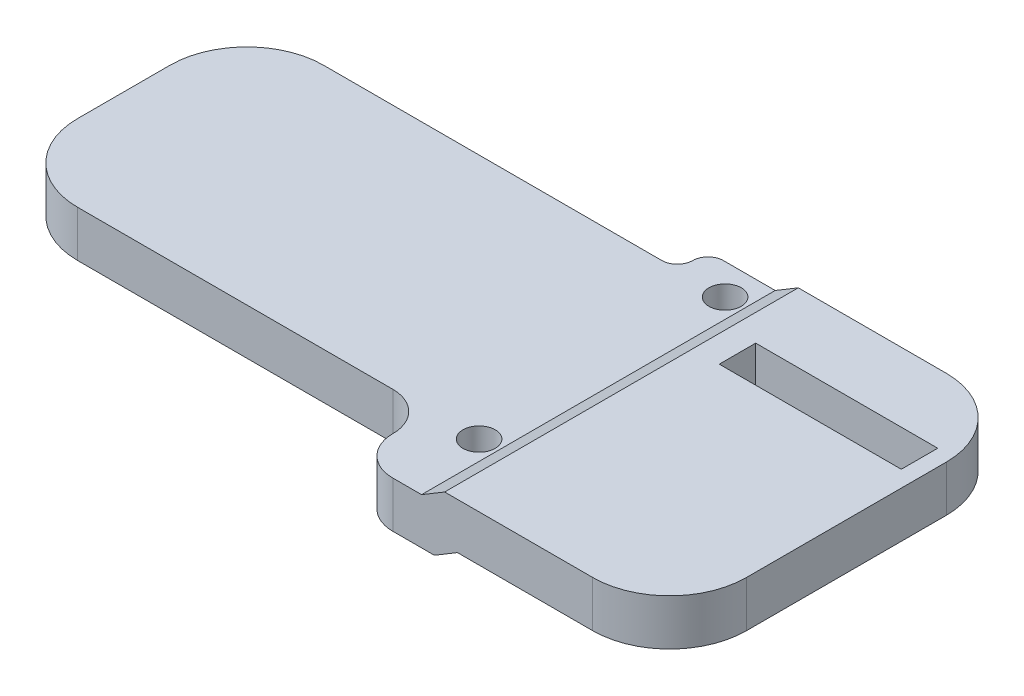
ISO-10303-21;
HEADER;
FILE_DESCRIPTION(('STEP AP214'),'2;1');
FILE_NAME('part.step','',(''),(''),'','','');
FILE_SCHEMA(('AUTOMOTIVE_DESIGN { 1 0 10303 214 1 1 1 1 }'));
ENDSEC;
DATA;
#1=APPLICATION_CONTEXT('core data for automotive mechanical design processes');
#2=APPLICATION_PROTOCOL_DEFINITION('international standard','automotive_design',2000,#1);
#3=PRODUCT_CONTEXT('',#1,'mechanical');
#4=PRODUCT('Part','Part','',(#3));
#5=PRODUCT_RELATED_PRODUCT_CATEGORY('part','',(#4));
#6=PRODUCT_DEFINITION_FORMATION('','',#4);
#7=PRODUCT_DEFINITION_CONTEXT('part definition',#1,'design');
#8=PRODUCT_DEFINITION('design','',#6,#7);
#9=PRODUCT_DEFINITION_SHAPE('','',#8);
#10=(LENGTH_UNIT() NAMED_UNIT(*) SI_UNIT(.MILLI.,.METRE.));
#11=(NAMED_UNIT(*) PLANE_ANGLE_UNIT() SI_UNIT($,.RADIAN.));
#12=(NAMED_UNIT(*) SI_UNIT($,.STERADIAN.) SOLID_ANGLE_UNIT());
#13=UNCERTAINTY_MEASURE_WITH_UNIT(LENGTH_MEASURE(1.E-05),#10,'distance_accuracy_value','');
#14=(GEOMETRIC_REPRESENTATION_CONTEXT(3) GLOBAL_UNCERTAINTY_ASSIGNED_CONTEXT((#13)) GLOBAL_UNIT_ASSIGNED_CONTEXT((#10,
#11,#12)) REPRESENTATION_CONTEXT('',''));
#15=CARTESIAN_POINT('',(0.,0.,0.));
#16=DIRECTION('',(0.,0.,1.));
#17=DIRECTION('',(1.,0.,0.));
#18=AXIS2_PLACEMENT_3D('',#15,#16,#17);
#19=CARTESIAN_POINT('',(0.,3.,-16.));
#20=DIRECTION('',(0.,0.,-1.));
#21=DIRECTION('',(-1.,0.,0.));
#22=AXIS2_PLACEMENT_3D('',#19,#20,#21);
#23=PLANE('',#22);
#24=DIRECTION('',(1.,0.,0.));
#25=VECTOR('',#24,1.);
#26=CARTESIAN_POINT('',(0.,0.,-16.));
#27=LINE('',#26,#25);
#28=CARTESIAN_POINT('',(5.,0.,-16.));
#29=VERTEX_POINT('',#28);
#30=CARTESIAN_POINT('',(27.,0.,-16.));
#31=VERTEX_POINT('',#30);
#32=EDGE_CURVE('E319',#29,#31,#27,.T.);
#33=ORIENTED_EDGE('',*,*,#32,.F.);
#34=DIRECTION('',(0.,-1.,0.));
#35=VECTOR('',#34,1.);
#36=CARTESIAN_POINT('',(5.,3.,-16.));
#37=LINE('',#36,#35);
#38=CARTESIAN_POINT('',(5.,3.,-16.));
#39=VERTEX_POINT('',#38);
#40=EDGE_CURVE('E439',#29,#39,#37,.F.);
#41=ORIENTED_EDGE('',*,*,#40,.T.);
#42=DIRECTION('',(1.,0.,0.));
#43=VECTOR('',#42,1.);
#44=CARTESIAN_POINT('',(0.,3.,-16.));
#45=LINE('',#44,#43);
#46=CARTESIAN_POINT('',(27.,3.,-16.));
#47=VERTEX_POINT('',#46);
#48=EDGE_CURVE('E337',#39,#47,#45,.T.);
#49=ORIENTED_EDGE('',*,*,#48,.T.);
#50=DIRECTION('',(0.,-1.,0.));
#51=VECTOR('',#50,1.);
#52=CARTESIAN_POINT('',(27.,3.,-16.));
#53=LINE('',#52,#51);
#54=EDGE_CURVE('E369',#47,#31,#53,.T.);
#55=ORIENTED_EDGE('',*,*,#54,.T.);
#56=EDGE_LOOP('',(#33,#41,#49,#55));
#57=FACE_BOUND('',#56,.T.);
#58=ADVANCED_FACE('F37',(#57),#23,.T.);
#59=CARTESIAN_POINT('',(0.,3.,0.));
#60=DIRECTION('',(1.,0.,0.));
#61=DIRECTION('',(0.,0.,-1.));
#62=AXIS2_PLACEMENT_3D('',#59,#60,#61);
#63=PLANE('',#62);
#64=DIRECTION('',(0.,0.,1.));
#65=VECTOR('',#64,1.);
#66=CARTESIAN_POINT('',(0.,0.,0.));
#67=LINE('',#66,#65);
#68=CARTESIAN_POINT('',(0.,0.,-11.));
#69=VERTEX_POINT('',#68);
#70=CARTESIAN_POINT('',(0.,0.,-5.));
#71=VERTEX_POINT('',#70);
#72=EDGE_CURVE('E338',#69,#71,#67,.T.);
#73=ORIENTED_EDGE('',*,*,#72,.T.);
#74=DIRECTION('',(0.,-1.,0.));
#75=VECTOR('',#74,1.);
#76=CARTESIAN_POINT('',(0.,3.,-5.));
#77=LINE('',#76,#75);
#78=CARTESIAN_POINT('',(0.,3.,-5.));
#79=VERTEX_POINT('',#78);
#80=EDGE_CURVE('E495',#71,#79,#77,.F.);
#81=ORIENTED_EDGE('',*,*,#80,.T.);
#82=DIRECTION('',(0.,0.,1.));
#83=VECTOR('',#82,1.);
#84=CARTESIAN_POINT('',(0.,3.,0.));
#85=LINE('',#84,#83);
#86=CARTESIAN_POINT('',(0.,3.,-11.));
#87=VERTEX_POINT('',#86);
#88=EDGE_CURVE('E333',#87,#79,#85,.T.);
#89=ORIENTED_EDGE('',*,*,#88,.F.);
#90=DIRECTION('',(0.,-1.,0.));
#91=VECTOR('',#90,1.);
#92=CARTESIAN_POINT('',(0.,0.,-11.));
#93=LINE('',#92,#91);
#94=EDGE_CURVE('E501',#87,#69,#93,.T.);
#95=ORIENTED_EDGE('',*,*,#94,.T.);
#96=EDGE_LOOP('',(#73,#81,#89,#95));
#97=FACE_BOUND('',#96,.T.);
#98=ADVANCED_FACE('F465',(#97),#63,.F.);
#99=CARTESIAN_POINT('',(0.,3.,0.));
#100=DIRECTION('',(0.,0.,-1.));
#101=DIRECTION('',(-1.,0.,0.));
#102=AXIS2_PLACEMENT_3D('',#99,#100,#101);
#103=PLANE('',#102);
#104=DIRECTION('',(1.,0.,0.));
#105=VECTOR('',#104,1.);
#106=CARTESIAN_POINT('',(0.,0.,0.));
#107=LINE('',#106,#105);
#108=CARTESIAN_POINT('',(5.,0.,0.));
#109=VERTEX_POINT('',#108);
#110=CARTESIAN_POINT('',(25.5,0.,0.));
#111=VERTEX_POINT('',#110);
#112=EDGE_CURVE('E341',#109,#111,#107,.T.);
#113=ORIENTED_EDGE('',*,*,#112,.T.);
#114=DIRECTION('',(0.,-1.,0.));
#115=VECTOR('',#114,1.);
#116=CARTESIAN_POINT('',(25.5,3.,0.));
#117=LINE('',#116,#115);
#118=CARTESIAN_POINT('',(25.5,3.,0.));
#119=VERTEX_POINT('',#118);
#120=EDGE_CURVE('E59',#111,#119,#117,.F.);
#121=ORIENTED_EDGE('',*,*,#120,.T.);
#122=DIRECTION('',(1.,0.,0.));
#123=VECTOR('',#122,1.);
#124=CARTESIAN_POINT('',(0.,3.,0.));
#125=LINE('',#124,#123);
#126=CARTESIAN_POINT('',(5.,3.,0.));
#127=VERTEX_POINT('',#126);
#128=EDGE_CURVE('E336',#127,#119,#125,.T.);
#129=ORIENTED_EDGE('',*,*,#128,.F.);
#130=DIRECTION('',(0.,-1.,0.));
#131=VECTOR('',#130,1.);
#132=CARTESIAN_POINT('',(5.,3.,0.));
#133=LINE('',#132,#131);
#134=EDGE_CURVE('E353',#127,#109,#133,.T.);
#135=ORIENTED_EDGE('',*,*,#134,.T.);
#136=EDGE_LOOP('',(#113,#121,#129,#135));
#137=FACE_BOUND('',#136,.T.);
#138=ADVANCED_FACE('F453',(#137),#103,.F.);
#139=CARTESIAN_POINT('',(0.,3.,0.));
#140=DIRECTION('',(0.,1.,0.));
#141=DIRECTION('',(0.,0.,1.));
#142=AXIS2_PLACEMENT_3D('',#139,#140,#141);
#143=PLANE('',#142);
#144=CARTESIAN_POINT('',(31.11,3.,-16.));
#145=DIRECTION('',(0.,1.,0.));
#146=DIRECTION('',(0.,0.,1.));
#147=AXIS2_PLACEMENT_3D('',#144,#145,#146);
#148=CIRCLE('',#147,1.05);
#149=CARTESIAN_POINT('',(31.11,3.,-14.95));
#150=VERTEX_POINT('',#149);
#151=EDGE_CURVE('E772',#150,#150,#148,.T.);
#152=ORIENTED_EDGE('',*,*,#151,.F.);
#153=EDGE_LOOP('',(#152));
#154=FACE_BOUND('',#153,.T.);
#155=CARTESIAN_POINT('',(31.11,3.,0.));
#156=DIRECTION('',(0.,1.,0.));
#157=DIRECTION('',(0.,0.,1.));
#158=AXIS2_PLACEMENT_3D('',#155,#156,#157);
#159=CIRCLE('',#158,1.05);
#160=CARTESIAN_POINT('',(31.11,3.,1.05));
#161=VERTEX_POINT('',#160);
#162=EDGE_CURVE('E241',#161,#161,#159,.T.);
#163=ORIENTED_EDGE('',*,*,#162,.F.);
#164=EDGE_LOOP('',(#163));
#165=FACE_BOUND('',#164,.T.);
#166=ORIENTED_EDGE('',*,*,#128,.T.);
#167=CARTESIAN_POINT('',(25.5,3.,2.5));
#168=DIRECTION('',(0.,1.,0.));
#169=DIRECTION('',(0.,0.,1.));
#170=AXIS2_PLACEMENT_3D('',#167,#168,#169);
#171=CIRCLE('',#170,2.5);
#172=CARTESIAN_POINT('',(28.,3.,2.5));
#173=VERTEX_POINT('',#172);
#174=EDGE_CURVE('E11',#119,#173,#171,.F.);
#175=ORIENTED_EDGE('',*,*,#174,.T.);
#176=CARTESIAN_POINT('',(30.5,3.,2.5));
#177=DIRECTION('',(0.,1.,0.));
#178=DIRECTION('',(0.,0.,1.));
#179=AXIS2_PLACEMENT_3D('',#176,#177,#178);
#180=CIRCLE('',#179,2.5);
#181=CARTESIAN_POINT('',(30.5,3.,5.));
#182=VERTEX_POINT('',#181);
#183=EDGE_CURVE('E437',#173,#182,#180,.T.);
#184=ORIENTED_EDGE('',*,*,#183,.T.);
#185=DIRECTION('',(1.,0.,0.));
#186=VECTOR('',#185,1.);
#187=CARTESIAN_POINT('',(28.,3.,5.));
#188=LINE('',#187,#186);
#189=CARTESIAN_POINT('',(32.3690481051547,3.,5.));
#190=VERTEX_POINT('',#189);
#191=EDGE_CURVE('E307',#182,#190,#188,.T.);
#192=ORIENTED_EDGE('',*,*,#191,.T.);
#193=DIRECTION('',(0.,0.,-1.));
#194=VECTOR('',#193,1.);
#195=CARTESIAN_POINT('',(32.3690481051547,3.,5.));
#196=LINE('',#195,#194);
#197=CARTESIAN_POINT('',(32.3690481051547,3.,-18.));
#198=VERTEX_POINT('',#197);
#199=EDGE_CURVE('E325',#190,#198,#196,.T.);
#200=ORIENTED_EDGE('',*,*,#199,.T.);
#201=DIRECTION('',(1.,0.,0.));
#202=VECTOR('',#201,1.);
#203=CARTESIAN_POINT('',(28.,3.,-18.));
#204=LINE('',#203,#202);
#205=CARTESIAN_POINT('',(29.,3.,-18.));
#206=VERTEX_POINT('',#205);
#207=EDGE_CURVE('E292',#206,#198,#204,.T.);
#208=ORIENTED_EDGE('',*,*,#207,.F.);
#209=CARTESIAN_POINT('',(29.,3.,-17.));
#210=DIRECTION('',(0.,1.,0.));
#211=DIRECTION('',(0.,0.,1.));
#212=AXIS2_PLACEMENT_3D('',#209,#210,#211);
#213=CIRCLE('',#212,1.);
#214=CARTESIAN_POINT('',(28.,3.,-17.));
#215=VERTEX_POINT('',#214);
#216=EDGE_CURVE('E367',#206,#215,#213,.T.);
#217=ORIENTED_EDGE('',*,*,#216,.T.);
#218=CARTESIAN_POINT('',(27.,3.,-17.));
#219=DIRECTION('',(0.,1.,0.));
#220=DIRECTION('',(0.,0.,1.));
#221=AXIS2_PLACEMENT_3D('',#218,#219,#220);
#222=CIRCLE('',#221,1.);
#223=EDGE_CURVE('E374',#215,#47,#222,.F.);
#224=ORIENTED_EDGE('',*,*,#223,.T.);
#225=ORIENTED_EDGE('',*,*,#48,.F.);
#226=CARTESIAN_POINT('',(5.,3.,-11.));
#227=DIRECTION('',(0.,1.,0.));
#228=DIRECTION('',(0.,0.,1.));
#229=AXIS2_PLACEMENT_3D('',#226,#227,#228);
#230=CIRCLE('',#229,5.);
#231=EDGE_CURVE('E496',#39,#87,#230,.T.);
#232=ORIENTED_EDGE('',*,*,#231,.T.);
#233=ORIENTED_EDGE('',*,*,#88,.T.);
#234=CARTESIAN_POINT('',(5.,3.,-5.));
#235=DIRECTION('',(0.,1.,0.));
#236=DIRECTION('',(0.,0.,1.));
#237=AXIS2_PLACEMENT_3D('',#234,#235,#236);
#238=CIRCLE('',#237,5.);
#239=EDGE_CURVE('E442',#79,#127,#238,.T.);
#240=ORIENTED_EDGE('',*,*,#239,.T.);
#241=EDGE_LOOP('',(#166,#175,#184,#192,#200,#208,#217,#224,#225,#232,#233,#240));
#242=FACE_BOUND('',#241,.T.);
#243=ADVANCED_FACE('F512',(#154,#165,#242),#143,.T.);
#244=CARTESIAN_POINT('',(0.,0.,0.));
#245=DIRECTION('',(0.,1.,0.));
#246=DIRECTION('',(0.,0.,1.));
#247=AXIS2_PLACEMENT_3D('',#244,#245,#246);
#248=PLANE('',#247);
#249=CARTESIAN_POINT('',(31.11,0.,-16.));
#250=DIRECTION('',(0.,-1.,0.));
#251=DIRECTION('',(0.,0.,-1.));
#252=AXIS2_PLACEMENT_3D('',#249,#250,#251);
#253=CIRCLE('',#252,1.05);
#254=CARTESIAN_POINT('',(31.11,0.,-17.05));
#255=VERTEX_POINT('',#254);
#256=EDGE_CURVE('E381',#255,#255,#253,.T.);
#257=ORIENTED_EDGE('',*,*,#256,.F.);
#258=EDGE_LOOP('',(#257));
#259=FACE_BOUND('',#258,.T.);
#260=CARTESIAN_POINT('',(31.11,0.,0.));
#261=DIRECTION('',(0.,-1.,0.));
#262=DIRECTION('',(0.,0.,-1.));
#263=AXIS2_PLACEMENT_3D('',#260,#261,#262);
#264=CIRCLE('',#263,1.05);
#265=CARTESIAN_POINT('',(31.11,0.,-1.05));
#266=VERTEX_POINT('',#265);
#267=EDGE_CURVE('E776',#266,#266,#264,.T.);
#268=ORIENTED_EDGE('',*,*,#267,.F.);
#269=EDGE_LOOP('',(#268));
#270=FACE_BOUND('',#269,.T.);
#271=DIRECTION('',(1.,0.,0.));
#272=VECTOR('',#271,1.);
#273=CARTESIAN_POINT('',(4.5,0.,-13.92));
#274=LINE('',#273,#272);
#275=CARTESIAN_POINT('',(4.5,0.,-13.92));
#276=VERTEX_POINT('',#275);
#277=CARTESIAN_POINT('',(27.1,0.,-13.92));
#278=VERTEX_POINT('',#277);
#279=EDGE_CURVE('E247',#276,#278,#274,.T.);
#280=ORIENTED_EDGE('',*,*,#279,.F.);
#281=DIRECTION('',(0.,0.,-1.));
#282=VECTOR('',#281,1.);
#283=CARTESIAN_POINT('',(4.5,0.,-2.08));
#284=LINE('',#283,#282);
#285=CARTESIAN_POINT('',(4.5,0.,-2.08));
#286=VERTEX_POINT('',#285);
#287=EDGE_CURVE('E218',#286,#276,#284,.T.);
#288=ORIENTED_EDGE('',*,*,#287,.F.);
#289=DIRECTION('',(-1.,0.,0.));
#290=VECTOR('',#289,1.);
#291=CARTESIAN_POINT('',(4.5,0.,-2.08));
#292=LINE('',#291,#290);
#293=CARTESIAN_POINT('',(27.1,0.,-2.08));
#294=VERTEX_POINT('',#293);
#295=EDGE_CURVE('E235',#294,#286,#292,.T.);
#296=ORIENTED_EDGE('',*,*,#295,.F.);
#297=DIRECTION('',(0.,0.,1.));
#298=VECTOR('',#297,1.);
#299=CARTESIAN_POINT('',(27.1,0.,-2.08));
#300=LINE('',#299,#298);
#301=EDGE_CURVE('E238',#278,#294,#300,.T.);
#302=ORIENTED_EDGE('',*,*,#301,.F.);
#303=EDGE_LOOP('',(#280,#288,#296,#302));
#304=FACE_BOUND('',#303,.T.);
#305=DIRECTION('',(1.,0.,0.));
#306=VECTOR('',#305,1.);
#307=CARTESIAN_POINT('',(28.,0.,5.));
#308=LINE('',#307,#306);
#309=CARTESIAN_POINT('',(30.5,0.,5.));
#310=VERTEX_POINT('',#309);
#311=CARTESIAN_POINT('',(33.2,0.,5.));
#312=VERTEX_POINT('',#311);
#313=EDGE_CURVE('E305',#310,#312,#308,.T.);
#314=ORIENTED_EDGE('',*,*,#313,.F.);
#315=CARTESIAN_POINT('',(30.5,0.,2.5));
#316=DIRECTION('',(0.,1.,0.));
#317=DIRECTION('',(0.,0.,1.));
#318=AXIS2_PLACEMENT_3D('',#315,#316,#317);
#319=CIRCLE('',#318,2.5);
#320=CARTESIAN_POINT('',(28.,0.,2.5));
#321=VERTEX_POINT('',#320);
#322=EDGE_CURVE('E438',#310,#321,#319,.F.);
#323=ORIENTED_EDGE('',*,*,#322,.T.);
#324=CARTESIAN_POINT('',(25.5,0.,2.5));
#325=DIRECTION('',(0.,1.,0.));
#326=DIRECTION('',(0.,0.,1.));
#327=AXIS2_PLACEMENT_3D('',#324,#325,#326);
#328=CIRCLE('',#327,2.5);
#329=EDGE_CURVE('E46',#321,#111,#328,.T.);
#330=ORIENTED_EDGE('',*,*,#329,.T.);
#331=ORIENTED_EDGE('',*,*,#112,.F.);
#332=CARTESIAN_POINT('',(5.,0.,-5.));
#333=DIRECTION('',(0.,1.,0.));
#334=DIRECTION('',(0.,0.,1.));
#335=AXIS2_PLACEMENT_3D('',#332,#333,#334);
#336=CIRCLE('',#335,5.);
#337=EDGE_CURVE('E503',#109,#71,#336,.F.);
#338=ORIENTED_EDGE('',*,*,#337,.T.);
#339=ORIENTED_EDGE('',*,*,#72,.F.);
#340=CARTESIAN_POINT('',(5.,0.,-11.));
#341=DIRECTION('',(0.,1.,0.));
#342=DIRECTION('',(0.,0.,1.));
#343=AXIS2_PLACEMENT_3D('',#340,#341,#342);
#344=CIRCLE('',#343,5.);
#345=EDGE_CURVE('E356',#69,#29,#344,.F.);
#346=ORIENTED_EDGE('',*,*,#345,.T.);
#347=ORIENTED_EDGE('',*,*,#32,.T.);
#348=CARTESIAN_POINT('',(27.,0.,-17.));
#349=DIRECTION('',(0.,1.,0.));
#350=DIRECTION('',(0.,0.,1.));
#351=AXIS2_PLACEMENT_3D('',#348,#349,#350);
#352=CIRCLE('',#351,1.);
#353=CARTESIAN_POINT('',(28.,0.,-17.));
#354=VERTEX_POINT('',#353);
#355=EDGE_CURVE('E372',#31,#354,#352,.T.);
#356=ORIENTED_EDGE('',*,*,#355,.T.);
#357=CARTESIAN_POINT('',(29.,0.,-17.));
#358=DIRECTION('',(0.,1.,0.));
#359=DIRECTION('',(0.,0.,1.));
#360=AXIS2_PLACEMENT_3D('',#357,#358,#359);
#361=CIRCLE('',#360,1.);
#362=CARTESIAN_POINT('',(29.,0.,-18.));
#363=VERTEX_POINT('',#362);
#364=EDGE_CURVE('E352',#354,#363,#361,.F.);
#365=ORIENTED_EDGE('',*,*,#364,.T.);
#366=DIRECTION('',(1.,0.,0.));
#367=VECTOR('',#366,1.);
#368=CARTESIAN_POINT('',(28.,0.,-18.));
#369=LINE('',#368,#367);
#370=CARTESIAN_POINT('',(33.2,0.,-18.));
#371=VERTEX_POINT('',#370);
#372=EDGE_CURVE('E290',#363,#371,#369,.T.);
#373=ORIENTED_EDGE('',*,*,#372,.T.);
#374=DIRECTION('',(0.,0.,-1.));
#375=VECTOR('',#374,1.);
#376=CARTESIAN_POINT('',(33.2,0.,5.));
#377=LINE('',#376,#375);
#378=EDGE_CURVE('E328',#312,#371,#377,.T.);
#379=ORIENTED_EDGE('',*,*,#378,.F.);
#380=EDGE_LOOP('',(#314,#323,#330,#331,#338,#339,#346,#347,#356,#365,#373,#379));
#381=FACE_BOUND('',#380,.T.);
#382=ADVANCED_FACE('F451',(#259,#270,#304,#381),#248,.F.);
#383=CARTESIAN_POINT('',(48.5,0.9,5.));
#384=DIRECTION('',(0.,-1.,0.));
#385=DIRECTION('',(1.,0.,0.));
#386=AXIS2_PLACEMENT_3D('',#383,#384,#385);
#387=PLANE('',#386);
#388=DIRECTION('',(0.,0.,-1.));
#389=VECTOR('',#388,1.);
#390=CARTESIAN_POINT('',(35.6,0.899999999999998,5.));
#391=LINE('',#390,#389);
#392=CARTESIAN_POINT('',(35.6,0.899999999999999,-11.13));
#393=VERTEX_POINT('',#392);
#394=CARTESIAN_POINT('',(35.6,0.899999999999999,-13.5));
#395=VERTEX_POINT('',#394);
#396=EDGE_CURVE('E283',#393,#395,#391,.T.);
#397=ORIENTED_EDGE('',*,*,#396,.F.);
#398=DIRECTION('',(-1.,0.,0.));
#399=VECTOR('',#398,1.);
#400=CARTESIAN_POINT('',(48.5,0.9,-11.13));
#401=LINE('',#400,#399);
#402=CARTESIAN_POINT('',(47.44,0.9,-11.13));
#403=VERTEX_POINT('',#402);
#404=EDGE_CURVE('E270',#403,#393,#401,.T.);
#405=ORIENTED_EDGE('',*,*,#404,.F.);
#406=DIRECTION('',(0.,0.,1.));
#407=VECTOR('',#406,1.);
#408=CARTESIAN_POINT('',(47.44,0.9,5.));
#409=LINE('',#408,#407);
#410=CARTESIAN_POINT('',(47.44,0.9,-13.5));
#411=VERTEX_POINT('',#410);
#412=EDGE_CURVE('E278',#411,#403,#409,.T.);
#413=ORIENTED_EDGE('',*,*,#412,.F.);
#414=DIRECTION('',(1.,0.,0.));
#415=VECTOR('',#414,1.);
#416=CARTESIAN_POINT('',(48.5,0.9,-13.5));
#417=LINE('',#416,#415);
#418=EDGE_CURVE('E281',#395,#411,#417,.T.);
#419=ORIENTED_EDGE('',*,*,#418,.F.);
#420=EDGE_LOOP('',(#397,#405,#413,#419));
#421=FACE_BOUND('',#420,.T.);
#422=DIRECTION('',(-1.,0.,0.));
#423=VECTOR('',#422,1.);
#424=CARTESIAN_POINT('',(48.5,0.9,-18.));
#425=LINE('',#424,#423);
#426=CARTESIAN_POINT('',(43.5,0.899999999999999,-18.));
#427=VERTEX_POINT('',#426);
#428=CARTESIAN_POINT('',(34.7,0.899999999999998,-18.));
#429=VERTEX_POINT('',#428);
#430=EDGE_CURVE('E285',#427,#429,#425,.T.);
#431=ORIENTED_EDGE('',*,*,#430,.F.);
#432=CARTESIAN_POINT('',(43.5,0.899999999999999,-13.));
#433=DIRECTION('',(0.,-1.,0.));
#434=DIRECTION('',(1.,0.,0.));
#435=AXIS2_PLACEMENT_3D('',#432,#433,#434);
#436=CIRCLE('',#435,5.);
#437=CARTESIAN_POINT('',(48.5,0.9,-13.));
#438=VERTEX_POINT('',#437);
#439=EDGE_CURVE('E386',#427,#438,#436,.T.);
#440=ORIENTED_EDGE('',*,*,#439,.T.);
#441=DIRECTION('',(0.,0.,-1.));
#442=VECTOR('',#441,1.);
#443=CARTESIAN_POINT('',(48.5,0.9,5.));
#444=LINE('',#443,#442);
#445=CARTESIAN_POINT('',(48.5,0.9,0.));
#446=VERTEX_POINT('',#445);
#447=EDGE_CURVE('E316',#446,#438,#444,.T.);
#448=ORIENTED_EDGE('',*,*,#447,.F.);
#449=CARTESIAN_POINT('',(43.5,0.899999999999999,0.));
#450=DIRECTION('',(0.,-1.,0.));
#451=DIRECTION('',(1.,0.,0.));
#452=AXIS2_PLACEMENT_3D('',#449,#450,#451);
#453=CIRCLE('',#452,5.);
#454=CARTESIAN_POINT('',(43.5,0.899999999999999,5.));
#455=VERTEX_POINT('',#454);
#456=EDGE_CURVE('E384',#446,#455,#453,.T.);
#457=ORIENTED_EDGE('',*,*,#456,.T.);
#458=DIRECTION('',(-1.,0.,0.));
#459=VECTOR('',#458,1.);
#460=CARTESIAN_POINT('',(48.5,0.9,5.));
#461=LINE('',#460,#459);
#462=CARTESIAN_POINT('',(34.7,0.899999999999998,5.));
#463=VERTEX_POINT('',#462);
#464=EDGE_CURVE('E300',#455,#463,#461,.T.);
#465=ORIENTED_EDGE('',*,*,#464,.T.);
#466=DIRECTION('',(0.,0.,-1.));
#467=VECTOR('',#466,1.);
#468=CARTESIAN_POINT('',(34.7,0.899999999999998,5.));
#469=LINE('',#468,#467);
#470=EDGE_CURVE('E315',#463,#429,#469,.T.);
#471=ORIENTED_EDGE('',*,*,#470,.T.);
#472=EDGE_LOOP('',(#431,#440,#448,#457,#465,#471));
#473=FACE_BOUND('',#472,.T.);
#474=ADVANCED_FACE('F418',(#421,#473),#387,.T.);
#475=CARTESIAN_POINT('',(48.5,3.9,5.));
#476=DIRECTION('',(1.,0.,0.));
#477=DIRECTION('',(0.,0.,-1.));
#478=AXIS2_PLACEMENT_3D('',#475,#476,#477);
#479=PLANE('',#478);
#480=ORIENTED_EDGE('',*,*,#447,.T.);
#481=DIRECTION('',(0.,-1.,0.));
#482=VECTOR('',#481,1.);
#483=CARTESIAN_POINT('',(48.5,3.9,-13.));
#484=LINE('',#483,#482);
#485=CARTESIAN_POINT('',(48.5,3.9,-13.));
#486=VERTEX_POINT('',#485);
#487=EDGE_CURVE('E391',#438,#486,#484,.F.);
#488=ORIENTED_EDGE('',*,*,#487,.T.);
#489=DIRECTION('',(0.,0.,-1.));
#490=VECTOR('',#489,1.);
#491=CARTESIAN_POINT('',(48.5,3.9,5.));
#492=LINE('',#491,#490);
#493=CARTESIAN_POINT('',(48.5,3.9,0.));
#494=VERTEX_POINT('',#493);
#495=EDGE_CURVE('E320',#494,#486,#492,.T.);
#496=ORIENTED_EDGE('',*,*,#495,.F.);
#497=DIRECTION('',(0.,-1.,0.));
#498=VECTOR('',#497,1.);
#499=CARTESIAN_POINT('',(48.5,3.9,0.));
#500=LINE('',#499,#498);
#501=EDGE_CURVE('E388',#494,#446,#500,.T.);
#502=ORIENTED_EDGE('',*,*,#501,.T.);
#503=EDGE_LOOP('',(#480,#488,#496,#502));
#504=FACE_BOUND('',#503,.T.);
#505=ADVANCED_FACE('F414',(#504),#479,.T.);
#506=CARTESIAN_POINT('',(33.8690481051547,3.9,5.));
#507=DIRECTION('',(0.,1.,0.));
#508=DIRECTION('',(-1.,0.,0.));
#509=AXIS2_PLACEMENT_3D('',#506,#507,#508);
#510=PLANE('',#509);
#511=DIRECTION('',(0.,0.,1.));
#512=VECTOR('',#511,1.);
#513=CARTESIAN_POINT('',(35.6,3.9,-13.5));
#514=LINE('',#513,#512);
#515=CARTESIAN_POINT('',(35.6,3.9,-13.5));
#516=VERTEX_POINT('',#515);
#517=CARTESIAN_POINT('',(35.6,3.9,-11.13));
#518=VERTEX_POINT('',#517);
#519=EDGE_CURVE('E253',#516,#518,#514,.T.);
#520=ORIENTED_EDGE('',*,*,#519,.F.);
#521=DIRECTION('',(-1.,0.,0.));
#522=VECTOR('',#521,1.);
#523=CARTESIAN_POINT('',(35.6,3.9,-13.5));
#524=LINE('',#523,#522);
#525=CARTESIAN_POINT('',(47.44,3.9,-13.5));
#526=VERTEX_POINT('',#525);
#527=EDGE_CURVE('E264',#526,#516,#524,.T.);
#528=ORIENTED_EDGE('',*,*,#527,.F.);
#529=DIRECTION('',(0.,0.,-1.));
#530=VECTOR('',#529,1.);
#531=CARTESIAN_POINT('',(47.44,3.9,-13.5));
#532=LINE('',#531,#530);
#533=CARTESIAN_POINT('',(47.44,3.9,-11.13));
#534=VERTEX_POINT('',#533);
#535=EDGE_CURVE('E261',#534,#526,#532,.T.);
#536=ORIENTED_EDGE('',*,*,#535,.F.);
#537=DIRECTION('',(1.,0.,0.));
#538=VECTOR('',#537,1.);
#539=CARTESIAN_POINT('',(35.6,3.9,-11.13));
#540=LINE('',#539,#538);
#541=EDGE_CURVE('E258',#518,#534,#540,.T.);
#542=ORIENTED_EDGE('',*,*,#541,.F.);
#543=EDGE_LOOP('',(#520,#528,#536,#542));
#544=FACE_BOUND('',#543,.T.);
#545=ORIENTED_EDGE('',*,*,#495,.T.);
#546=CARTESIAN_POINT('',(43.5,3.9,-13.));
#547=DIRECTION('',(0.,1.,0.));
#548=DIRECTION('',(-1.,0.,0.));
#549=AXIS2_PLACEMENT_3D('',#546,#547,#548);
#550=CIRCLE('',#549,5.);
#551=CARTESIAN_POINT('',(43.5,3.9,-18.));
#552=VERTEX_POINT('',#551);
#553=EDGE_CURVE('E394',#486,#552,#550,.T.);
#554=ORIENTED_EDGE('',*,*,#553,.T.);
#555=DIRECTION('',(1.,0.,0.));
#556=VECTOR('',#555,1.);
#557=CARTESIAN_POINT('',(33.8690481051547,3.9,-18.));
#558=LINE('',#557,#556);
#559=CARTESIAN_POINT('',(33.8690481051547,3.9,-18.));
#560=VERTEX_POINT('',#559);
#561=EDGE_CURVE('E297',#560,#552,#558,.T.);
#562=ORIENTED_EDGE('',*,*,#561,.F.);
#563=DIRECTION('',(0.,0.,-1.));
#564=VECTOR('',#563,1.);
#565=CARTESIAN_POINT('',(33.8690481051547,3.9,5.));
#566=LINE('',#565,#564);
#567=CARTESIAN_POINT('',(33.8690481051547,3.9,5.));
#568=VERTEX_POINT('',#567);
#569=EDGE_CURVE('E323',#568,#560,#566,.T.);
#570=ORIENTED_EDGE('',*,*,#569,.F.);
#571=DIRECTION('',(1.,0.,0.));
#572=VECTOR('',#571,1.);
#573=CARTESIAN_POINT('',(33.8690481051547,3.9,5.));
#574=LINE('',#573,#572);
#575=CARTESIAN_POINT('',(43.5,3.9,5.));
#576=VERTEX_POINT('',#575);
#577=EDGE_CURVE('E312',#568,#576,#574,.T.);
#578=ORIENTED_EDGE('',*,*,#577,.T.);
#579=CARTESIAN_POINT('',(43.5,3.9,0.));
#580=DIRECTION('',(0.,1.,0.));
#581=DIRECTION('',(-1.,0.,0.));
#582=AXIS2_PLACEMENT_3D('',#579,#580,#581);
#583=CIRCLE('',#582,5.);
#584=EDGE_CURVE('E393',#576,#494,#583,.T.);
#585=ORIENTED_EDGE('',*,*,#584,.T.);
#586=EDGE_LOOP('',(#545,#554,#562,#570,#578,#585));
#587=FACE_BOUND('',#586,.T.);
#588=ADVANCED_FACE('F408',(#544,#587),#510,.T.);
#589=CARTESIAN_POINT('',(32.3690481051547,3.,5.));
#590=DIRECTION('',(-0.514495755427525,0.857492925712545,0.));
#591=DIRECTION('',(-0.857492925712545,-0.514495755427525,0.));
#592=AXIS2_PLACEMENT_3D('',#589,#590,#591);
#593=PLANE('',#592);
#594=ORIENTED_EDGE('',*,*,#569,.T.);
#595=DIRECTION('',(0.857492925712545,0.514495755427525,0.));
#596=VECTOR('',#595,1.);
#597=CARTESIAN_POINT('',(32.3690481051547,3.,-18.));
#598=LINE('',#597,#596);
#599=EDGE_CURVE('E294',#198,#560,#598,.T.);
#600=ORIENTED_EDGE('',*,*,#599,.F.);
#601=ORIENTED_EDGE('',*,*,#199,.F.);
#602=DIRECTION('',(0.857492925712545,0.514495755427525,0.));
#603=VECTOR('',#602,1.);
#604=CARTESIAN_POINT('',(32.3690481051547,3.,5.));
#605=LINE('',#604,#603);
#606=EDGE_CURVE('E309',#190,#568,#605,.T.);
#607=ORIENTED_EDGE('',*,*,#606,.T.);
#608=EDGE_LOOP('',(#594,#600,#601,#607));
#609=FACE_BOUND('',#608,.T.);
#610=ADVANCED_FACE('F428',(#609),#593,.T.);
#611=CARTESIAN_POINT('',(34.7,0.899999999999998,5.));
#612=DIRECTION('',(0.514495755427525,-0.857492925712545,0.));
#613=DIRECTION('',(0.857492925712545,0.514495755427525,0.));
#614=AXIS2_PLACEMENT_3D('',#611,#612,#613);
#615=PLANE('',#614);
#616=ORIENTED_EDGE('',*,*,#378,.T.);
#617=DIRECTION('',(-0.857492925712545,-0.514495755427525,0.));
#618=VECTOR('',#617,1.);
#619=CARTESIAN_POINT('',(34.7,0.899999999999998,-18.));
#620=LINE('',#619,#618);
#621=EDGE_CURVE('E287',#429,#371,#620,.T.);
#622=ORIENTED_EDGE('',*,*,#621,.F.);
#623=ORIENTED_EDGE('',*,*,#470,.F.);
#624=DIRECTION('',(-0.857492925712545,-0.514495755427525,0.));
#625=VECTOR('',#624,1.);
#626=CARTESIAN_POINT('',(34.7,0.899999999999998,5.));
#627=LINE('',#626,#625);
#628=EDGE_CURVE('E302',#463,#312,#627,.T.);
#629=ORIENTED_EDGE('',*,*,#628,.T.);
#630=EDGE_LOOP('',(#616,#622,#623,#629));
#631=FACE_BOUND('',#630,.T.);
#632=ADVANCED_FACE('F522',(#631),#615,.T.);
#633=CARTESIAN_POINT('',(0.,0.,5.));
#634=DIRECTION('',(0.,0.,1.));
#635=DIRECTION('',(1.,0.,0.));
#636=AXIS2_PLACEMENT_3D('',#633,#634,#635);
#637=PLANE('',#636);
#638=ORIENTED_EDGE('',*,*,#191,.F.);
#639=DIRECTION('',(0.,-1.,0.));
#640=VECTOR('',#639,1.);
#641=CARTESIAN_POINT('',(30.5,0.,5.));
#642=LINE('',#641,#640);
#643=EDGE_CURVE('E431',#182,#310,#642,.T.);
#644=ORIENTED_EDGE('',*,*,#643,.T.);
#645=ORIENTED_EDGE('',*,*,#313,.T.);
#646=ORIENTED_EDGE('',*,*,#628,.F.);
#647=ORIENTED_EDGE('',*,*,#464,.F.);
#648=DIRECTION('',(0.,-1.,0.));
#649=VECTOR('',#648,1.);
#650=CARTESIAN_POINT('',(43.5,0.,5.));
#651=LINE('',#650,#649);
#652=EDGE_CURVE('E349',#455,#576,#651,.F.);
#653=ORIENTED_EDGE('',*,*,#652,.T.);
#654=ORIENTED_EDGE('',*,*,#577,.F.);
#655=ORIENTED_EDGE('',*,*,#606,.F.);
#656=EDGE_LOOP('',(#638,#644,#645,#646,#647,#653,#654,#655));
#657=FACE_BOUND('',#656,.T.);
#658=ADVANCED_FACE('F403',(#657),#637,.T.);
#659=CARTESIAN_POINT('',(0.,0.,-18.));
#660=DIRECTION('',(0.,0.,1.));
#661=DIRECTION('',(1.,0.,0.));
#662=AXIS2_PLACEMENT_3D('',#659,#660,#661);
#663=PLANE('',#662);
#664=ORIENTED_EDGE('',*,*,#561,.T.);
#665=DIRECTION('',(0.,-1.,0.));
#666=VECTOR('',#665,1.);
#667=CARTESIAN_POINT('',(43.5,0.9,-18.));
#668=LINE('',#667,#666);
#669=EDGE_CURVE('E377',#552,#427,#668,.T.);
#670=ORIENTED_EDGE('',*,*,#669,.T.);
#671=ORIENTED_EDGE('',*,*,#430,.T.);
#672=ORIENTED_EDGE('',*,*,#621,.T.);
#673=ORIENTED_EDGE('',*,*,#372,.F.);
#674=DIRECTION('',(0.,-1.,0.));
#675=VECTOR('',#674,1.);
#676=CARTESIAN_POINT('',(29.,0.,-18.));
#677=LINE('',#676,#675);
#678=EDGE_CURVE('E364',#363,#206,#677,.F.);
#679=ORIENTED_EDGE('',*,*,#678,.T.);
#680=ORIENTED_EDGE('',*,*,#207,.T.);
#681=ORIENTED_EDGE('',*,*,#599,.T.);
#682=EDGE_LOOP('',(#664,#670,#671,#672,#673,#679,#680,#681));
#683=FACE_BOUND('',#682,.T.);
#684=ADVANCED_FACE('F423',(#683),#663,.F.);
#685=CARTESIAN_POINT('',(35.6,-6.1,-13.5));
#686=DIRECTION('',(-1.,0.,0.));
#687=DIRECTION('',(0.,0.,1.));
#688=AXIS2_PLACEMENT_3D('',#685,#686,#687);
#689=PLANE('',#688);
#690=ORIENTED_EDGE('',*,*,#396,.T.);
#691=DIRECTION('',(0.,1.,0.));
#692=VECTOR('',#691,1.);
#693=CARTESIAN_POINT('',(35.6,-6.1,-13.5));
#694=LINE('',#693,#692);
#695=EDGE_CURVE('E268',#395,#516,#694,.T.);
#696=ORIENTED_EDGE('',*,*,#695,.T.);
#697=ORIENTED_EDGE('',*,*,#519,.T.);
#698=DIRECTION('',(0.,1.,0.));
#699=VECTOR('',#698,1.);
#700=CARTESIAN_POINT('',(35.6,-6.1,-11.13));
#701=LINE('',#700,#699);
#702=EDGE_CURVE('E267',#393,#518,#701,.T.);
#703=ORIENTED_EDGE('',*,*,#702,.F.);
#704=EDGE_LOOP('',(#690,#696,#697,#703));
#705=FACE_BOUND('',#704,.T.);
#706=ADVANCED_FACE('F587',(#705),#689,.F.);
#707=CARTESIAN_POINT('',(35.6,-6.1,-13.5));
#708=DIRECTION('',(0.,0.,-1.));
#709=DIRECTION('',(-1.,0.,0.));
#710=AXIS2_PLACEMENT_3D('',#707,#708,#709);
#711=PLANE('',#710);
#712=ORIENTED_EDGE('',*,*,#418,.T.);
#713=DIRECTION('',(0.,1.,0.));
#714=VECTOR('',#713,1.);
#715=CARTESIAN_POINT('',(47.44,-6.1,-13.5));
#716=LINE('',#715,#714);
#717=EDGE_CURVE('E271',#411,#526,#716,.T.);
#718=ORIENTED_EDGE('',*,*,#717,.T.);
#719=ORIENTED_EDGE('',*,*,#527,.T.);
#720=ORIENTED_EDGE('',*,*,#695,.F.);
#721=EDGE_LOOP('',(#712,#718,#719,#720));
#722=FACE_BOUND('',#721,.T.);
#723=ADVANCED_FACE('F592',(#722),#711,.F.);
#724=CARTESIAN_POINT('',(47.44,-6.1,-13.5));
#725=DIRECTION('',(1.,0.,0.));
#726=DIRECTION('',(0.,0.,-1.));
#727=AXIS2_PLACEMENT_3D('',#724,#725,#726);
#728=PLANE('',#727);
#729=ORIENTED_EDGE('',*,*,#412,.T.);
#730=DIRECTION('',(0.,1.,0.));
#731=VECTOR('',#730,1.);
#732=CARTESIAN_POINT('',(47.44,-6.1,-11.13));
#733=LINE('',#732,#731);
#734=EDGE_CURVE('E273',#403,#534,#733,.T.);
#735=ORIENTED_EDGE('',*,*,#734,.T.);
#736=ORIENTED_EDGE('',*,*,#535,.T.);
#737=ORIENTED_EDGE('',*,*,#717,.F.);
#738=EDGE_LOOP('',(#729,#735,#736,#737));
#739=FACE_BOUND('',#738,.T.);
#740=ADVANCED_FACE('F604',(#739),#728,.F.);
#741=CARTESIAN_POINT('',(35.6,-6.1,-11.13));
#742=DIRECTION('',(0.,0.,1.));
#743=DIRECTION('',(1.,0.,0.));
#744=AXIS2_PLACEMENT_3D('',#741,#742,#743);
#745=PLANE('',#744);
#746=ORIENTED_EDGE('',*,*,#404,.T.);
#747=ORIENTED_EDGE('',*,*,#702,.T.);
#748=ORIENTED_EDGE('',*,*,#541,.T.);
#749=ORIENTED_EDGE('',*,*,#734,.F.);
#750=EDGE_LOOP('',(#746,#747,#748,#749));
#751=FACE_BOUND('',#750,.T.);
#752=ADVANCED_FACE('F614',(#751),#745,.F.);
#753=CARTESIAN_POINT('',(4.5,1.,-2.08));
#754=DIRECTION('',(-1.,0.,0.));
#755=DIRECTION('',(0.,0.,1.));
#756=AXIS2_PLACEMENT_3D('',#753,#754,#755);
#757=PLANE('',#756);
#758=ORIENTED_EDGE('',*,*,#287,.T.);
#759=DIRECTION('',(0.,-1.,0.));
#760=VECTOR('',#759,1.);
#761=CARTESIAN_POINT('',(4.5,1.,-13.92));
#762=LINE('',#761,#760);
#763=CARTESIAN_POINT('',(4.5,1.,-13.92));
#764=VERTEX_POINT('',#763);
#765=EDGE_CURVE('E211',#764,#276,#762,.T.);
#766=ORIENTED_EDGE('',*,*,#765,.F.);
#767=DIRECTION('',(0.,0.,-1.));
#768=VECTOR('',#767,1.);
#769=CARTESIAN_POINT('',(4.5,1.,-2.08));
#770=LINE('',#769,#768);
#771=CARTESIAN_POINT('',(4.5,1.,-2.08));
#772=VERTEX_POINT('',#771);
#773=EDGE_CURVE('E215',#772,#764,#770,.T.);
#774=ORIENTED_EDGE('',*,*,#773,.F.);
#775=DIRECTION('',(0.,-1.,0.));
#776=VECTOR('',#775,1.);
#777=CARTESIAN_POINT('',(4.5,1.,-2.08));
#778=LINE('',#777,#776);
#779=EDGE_CURVE('E251',#772,#286,#778,.T.);
#780=ORIENTED_EDGE('',*,*,#779,.T.);
#781=EDGE_LOOP('',(#758,#766,#774,#780));
#782=FACE_BOUND('',#781,.T.);
#783=ADVANCED_FACE('F213',(#782),#757,.F.);
#784=CARTESIAN_POINT('',(4.5,1.,-2.08));
#785=DIRECTION('',(0.,0.,1.));
#786=DIRECTION('',(1.,0.,0.));
#787=AXIS2_PLACEMENT_3D('',#784,#785,#786);
#788=PLANE('',#787);
#789=ORIENTED_EDGE('',*,*,#295,.T.);
#790=ORIENTED_EDGE('',*,*,#779,.F.);
#791=DIRECTION('',(-1.,0.,0.));
#792=VECTOR('',#791,1.);
#793=CARTESIAN_POINT('',(4.5,1.,-2.08));
#794=LINE('',#793,#792);
#795=CARTESIAN_POINT('',(27.1,1.,-2.08));
#796=VERTEX_POINT('',#795);
#797=EDGE_CURVE('E223',#796,#772,#794,.T.);
#798=ORIENTED_EDGE('',*,*,#797,.F.);
#799=DIRECTION('',(0.,-1.,0.));
#800=VECTOR('',#799,1.);
#801=CARTESIAN_POINT('',(27.1,1.,-2.08));
#802=LINE('',#801,#800);
#803=EDGE_CURVE('E254',#796,#294,#802,.T.);
#804=ORIENTED_EDGE('',*,*,#803,.T.);
#805=EDGE_LOOP('',(#789,#790,#798,#804));
#806=FACE_BOUND('',#805,.T.);
#807=ADVANCED_FACE('F633',(#806),#788,.F.);
#808=CARTESIAN_POINT('',(27.1,1.,-2.08));
#809=DIRECTION('',(1.,0.,0.));
#810=DIRECTION('',(0.,0.,-1.));
#811=AXIS2_PLACEMENT_3D('',#808,#809,#810);
#812=PLANE('',#811);
#813=ORIENTED_EDGE('',*,*,#301,.T.);
#814=ORIENTED_EDGE('',*,*,#803,.F.);
#815=DIRECTION('',(0.,0.,1.));
#816=VECTOR('',#815,1.);
#817=CARTESIAN_POINT('',(27.1,1.,-2.08));
#818=LINE('',#817,#816);
#819=CARTESIAN_POINT('',(27.1,1.,-13.92));
#820=VERTEX_POINT('',#819);
#821=EDGE_CURVE('E231',#820,#796,#818,.T.);
#822=ORIENTED_EDGE('',*,*,#821,.F.);
#823=DIRECTION('',(0.,-1.,0.));
#824=VECTOR('',#823,1.);
#825=CARTESIAN_POINT('',(27.1,1.,-13.92));
#826=LINE('',#825,#824);
#827=EDGE_CURVE('E222',#820,#278,#826,.T.);
#828=ORIENTED_EDGE('',*,*,#827,.T.);
#829=EDGE_LOOP('',(#813,#814,#822,#828));
#830=FACE_BOUND('',#829,.T.);
#831=ADVANCED_FACE('F642',(#830),#812,.F.);
#832=CARTESIAN_POINT('',(4.5,1.,-13.92));
#833=DIRECTION('',(0.,0.,-1.));
#834=DIRECTION('',(-1.,0.,0.));
#835=AXIS2_PLACEMENT_3D('',#832,#833,#834);
#836=PLANE('',#835);
#837=ORIENTED_EDGE('',*,*,#279,.T.);
#838=ORIENTED_EDGE('',*,*,#827,.F.);
#839=DIRECTION('',(1.,0.,0.));
#840=VECTOR('',#839,1.);
#841=CARTESIAN_POINT('',(4.5,1.,-13.92));
#842=LINE('',#841,#840);
#843=EDGE_CURVE('E226',#764,#820,#842,.T.);
#844=ORIENTED_EDGE('',*,*,#843,.F.);
#845=ORIENTED_EDGE('',*,*,#765,.T.);
#846=EDGE_LOOP('',(#837,#838,#844,#845));
#847=FACE_BOUND('',#846,.T.);
#848=ADVANCED_FACE('F227',(#847),#836,.F.);
#849=CARTESIAN_POINT('',(0.,1.,0.));
#850=DIRECTION('',(0.,-1.,0.));
#851=DIRECTION('',(0.,0.,-1.));
#852=AXIS2_PLACEMENT_3D('',#849,#850,#851);
#853=PLANE('',#852);
#854=ORIENTED_EDGE('',*,*,#773,.T.);
#855=ORIENTED_EDGE('',*,*,#843,.T.);
#856=ORIENTED_EDGE('',*,*,#821,.T.);
#857=ORIENTED_EDGE('',*,*,#797,.T.);
#858=EDGE_LOOP('',(#854,#855,#856,#857));
#859=FACE_BOUND('',#858,.T.);
#860=ADVANCED_FACE('F233',(#859),#853,.T.);
#861=CARTESIAN_POINT('',(31.11,3.9,0.));
#862=DIRECTION('',(0.,-1.,0.));
#863=DIRECTION('',(0.,0.,-1.));
#864=AXIS2_PLACEMENT_3D('',#861,#862,#863);
#865=CYLINDRICAL_SURFACE('',#864,1.05);
#866=ORIENTED_EDGE('',*,*,#162,.T.);
#867=EDGE_LOOP('',(#866));
#868=FACE_BOUND('',#867,.T.);
#869=ORIENTED_EDGE('',*,*,#267,.T.);
#870=EDGE_LOOP('',(#869));
#871=FACE_BOUND('',#870,.T.);
#872=ADVANCED_FACE('F669',(#868,#871),#865,.F.);
#873=CARTESIAN_POINT('',(31.11,3.9,-16.));
#874=DIRECTION('',(0.,-1.,0.));
#875=DIRECTION('',(0.,0.,-1.));
#876=AXIS2_PLACEMENT_3D('',#873,#874,#875);
#877=CYLINDRICAL_SURFACE('',#876,1.05);
#878=ORIENTED_EDGE('',*,*,#151,.T.);
#879=EDGE_LOOP('',(#878));
#880=FACE_BOUND('',#879,.T.);
#881=ORIENTED_EDGE('',*,*,#256,.T.);
#882=EDGE_LOOP('',(#881));
#883=FACE_BOUND('',#882,.T.);
#884=ADVANCED_FACE('F483',(#880,#883),#877,.F.);
#885=CARTESIAN_POINT('',(27.,3.,-17.));
#886=DIRECTION('',(0.,-1.,0.));
#887=DIRECTION('',(0.,0.,-1.));
#888=AXIS2_PLACEMENT_3D('',#885,#886,#887);
#889=CYLINDRICAL_SURFACE('',#888,1.);
#890=ORIENTED_EDGE('',*,*,#54,.F.);
#891=ORIENTED_EDGE('',*,*,#223,.F.);
#892=DIRECTION('',(0.,-1.,0.));
#893=VECTOR('',#892,1.);
#894=CARTESIAN_POINT('',(28.,3.,-17.));
#895=LINE('',#894,#893);
#896=EDGE_CURVE('E378',#354,#215,#895,.F.);
#897=ORIENTED_EDGE('',*,*,#896,.F.);
#898=ORIENTED_EDGE('',*,*,#355,.F.);
#899=EDGE_LOOP('',(#890,#891,#897,#898));
#900=FACE_BOUND('',#899,.T.);
#901=ADVANCED_FACE('F479',(#900),#889,.F.);
#902=CARTESIAN_POINT('',(29.,3.,-17.));
#903=DIRECTION('',(0.,-1.,0.));
#904=DIRECTION('',(0.,0.,-1.));
#905=AXIS2_PLACEMENT_3D('',#902,#903,#904);
#906=CYLINDRICAL_SURFACE('',#905,1.);
#907=ORIENTED_EDGE('',*,*,#216,.F.);
#908=ORIENTED_EDGE('',*,*,#678,.F.);
#909=ORIENTED_EDGE('',*,*,#364,.F.);
#910=ORIENTED_EDGE('',*,*,#896,.T.);
#911=EDGE_LOOP('',(#907,#908,#909,#910));
#912=FACE_BOUND('',#911,.T.);
#913=ADVANCED_FACE('F476',(#912),#906,.T.);
#914=CARTESIAN_POINT('',(43.5,0.,-13.));
#915=DIRECTION('',(0.,1.,0.));
#916=DIRECTION('',(0.,0.,1.));
#917=AXIS2_PLACEMENT_3D('',#914,#915,#916);
#918=CYLINDRICAL_SURFACE('',#917,5.);
#919=ORIENTED_EDGE('',*,*,#553,.F.);
#920=ORIENTED_EDGE('',*,*,#487,.F.);
#921=ORIENTED_EDGE('',*,*,#439,.F.);
#922=ORIENTED_EDGE('',*,*,#669,.F.);
#923=EDGE_LOOP('',(#919,#920,#921,#922));
#924=FACE_BOUND('',#923,.T.);
#925=ADVANCED_FACE('F421',(#924),#918,.T.);
#926=CARTESIAN_POINT('',(43.5,3.9,0.));
#927=DIRECTION('',(0.,-1.,0.));
#928=DIRECTION('',(0.,0.,-1.));
#929=AXIS2_PLACEMENT_3D('',#926,#927,#928);
#930=CYLINDRICAL_SURFACE('',#929,5.);
#931=ORIENTED_EDGE('',*,*,#584,.F.);
#932=ORIENTED_EDGE('',*,*,#652,.F.);
#933=ORIENTED_EDGE('',*,*,#456,.F.);
#934=ORIENTED_EDGE('',*,*,#501,.F.);
#935=EDGE_LOOP('',(#931,#932,#933,#934));
#936=FACE_BOUND('',#935,.T.);
#937=ADVANCED_FACE('F411',(#936),#930,.T.);
#938=CARTESIAN_POINT('',(5.,3.,-5.));
#939=DIRECTION('',(0.,-1.,0.));
#940=DIRECTION('',(0.,0.,-1.));
#941=AXIS2_PLACEMENT_3D('',#938,#939,#940);
#942=CYLINDRICAL_SURFACE('',#941,5.);
#943=ORIENTED_EDGE('',*,*,#239,.F.);
#944=ORIENTED_EDGE('',*,*,#80,.F.);
#945=ORIENTED_EDGE('',*,*,#337,.F.);
#946=ORIENTED_EDGE('',*,*,#134,.F.);
#947=EDGE_LOOP('',(#943,#944,#945,#946));
#948=FACE_BOUND('',#947,.T.);
#949=ADVANCED_FACE('F461',(#948),#942,.T.);
#950=CARTESIAN_POINT('',(5.,3.,-11.));
#951=DIRECTION('',(0.,1.,0.));
#952=DIRECTION('',(0.,0.,1.));
#953=AXIS2_PLACEMENT_3D('',#950,#951,#952);
#954=CYLINDRICAL_SURFACE('',#953,5.);
#955=ORIENTED_EDGE('',*,*,#231,.F.);
#956=ORIENTED_EDGE('',*,*,#40,.F.);
#957=ORIENTED_EDGE('',*,*,#345,.F.);
#958=ORIENTED_EDGE('',*,*,#94,.F.);
#959=EDGE_LOOP('',(#955,#956,#957,#958));
#960=FACE_BOUND('',#959,.T.);
#961=ADVANCED_FACE('F456',(#960),#954,.T.);
#962=CARTESIAN_POINT('',(25.5,3.,2.5));
#963=DIRECTION('',(0.,1.,0.));
#964=DIRECTION('',(0.,0.,1.));
#965=AXIS2_PLACEMENT_3D('',#962,#963,#964);
#966=CYLINDRICAL_SURFACE('',#965,2.5);
#967=DIRECTION('',(0.,-1.,0.));
#968=VECTOR('',#967,1.);
#969=CARTESIAN_POINT('',(28.,0.,2.5));
#970=LINE('',#969,#968);
#971=EDGE_CURVE('E41',#173,#321,#970,.T.);
#972=ORIENTED_EDGE('',*,*,#971,.F.);
#973=ORIENTED_EDGE('',*,*,#174,.F.);
#974=ORIENTED_EDGE('',*,*,#120,.F.);
#975=ORIENTED_EDGE('',*,*,#329,.F.);
#976=EDGE_LOOP('',(#972,#973,#974,#975));
#977=FACE_BOUND('',#976,.T.);
#978=ADVANCED_FACE('F39',(#977),#966,.F.);
#979=CARTESIAN_POINT('',(30.5,0.,2.5));
#980=DIRECTION('',(0.,1.,0.));
#981=DIRECTION('',(0.,0.,1.));
#982=AXIS2_PLACEMENT_3D('',#979,#980,#981);
#983=CYLINDRICAL_SURFACE('',#982,2.5);
#984=ORIENTED_EDGE('',*,*,#183,.F.);
#985=ORIENTED_EDGE('',*,*,#971,.T.);
#986=ORIENTED_EDGE('',*,*,#322,.F.);
#987=ORIENTED_EDGE('',*,*,#643,.F.);
#988=EDGE_LOOP('',(#984,#985,#986,#987));
#989=FACE_BOUND('',#988,.T.);
#990=ADVANCED_FACE('F435',(#989),#983,.T.);
#991=CLOSED_SHELL('',(#58,#98,#138,#243,#382,#474,#505,#588,#610,#632,#658,#684,#706,#723,#740,
#752,#783,#807,#831,#848,#860,#872,#884,#901,#913,#925,#937,#949,#961,#978,#990));
#992=MANIFOLD_SOLID_BREP('B2',#991);
#993=ADVANCED_BREP_SHAPE_REPRESENTATION('',(#18,#992),#14);
#994=SHAPE_DEFINITION_REPRESENTATION(#9,#993);
ENDSEC;
END-ISO-10303-21;
